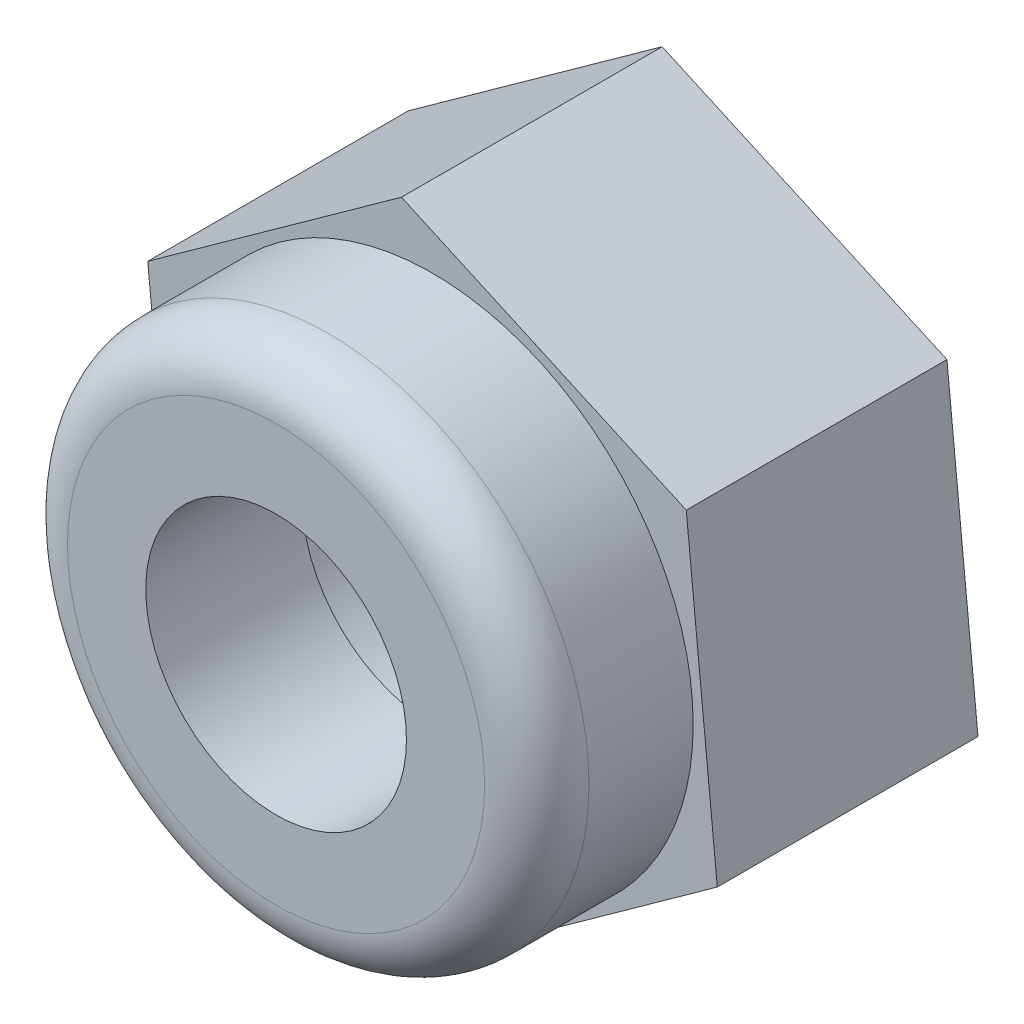
ISO-10303-21;
HEADER;
FILE_DESCRIPTION(('STEP AP214'),'2;1');
FILE_NAME('part.step','',(''),(''),'','','');
FILE_SCHEMA(('AUTOMOTIVE_DESIGN { 1 0 10303 214 1 1 1 1 }'));
ENDSEC;
DATA;
#1=APPLICATION_CONTEXT('core data for automotive mechanical design processes');
#2=APPLICATION_PROTOCOL_DEFINITION('international standard','automotive_design',2000,#1);
#3=PRODUCT_CONTEXT('',#1,'mechanical');
#4=PRODUCT('Part','Part','',(#3));
#5=PRODUCT_RELATED_PRODUCT_CATEGORY('part','',(#4));
#6=PRODUCT_DEFINITION_FORMATION('','',#4);
#7=PRODUCT_DEFINITION_CONTEXT('part definition',#1,'design');
#8=PRODUCT_DEFINITION('design','',#6,#7);
#9=PRODUCT_DEFINITION_SHAPE('','',#8);
#10=(LENGTH_UNIT() NAMED_UNIT(*) SI_UNIT(.MILLI.,.METRE.));
#11=(NAMED_UNIT(*) PLANE_ANGLE_UNIT() SI_UNIT($,.RADIAN.));
#12=(NAMED_UNIT(*) SI_UNIT($,.STERADIAN.) SOLID_ANGLE_UNIT());
#13=UNCERTAINTY_MEASURE_WITH_UNIT(LENGTH_MEASURE(1.E-05),#10,'distance_accuracy_value','');
#14=(GEOMETRIC_REPRESENTATION_CONTEXT(3) GLOBAL_UNCERTAINTY_ASSIGNED_CONTEXT((#13)) GLOBAL_UNIT_ASSIGNED_CONTEXT((#10,
#11,#12)) REPRESENTATION_CONTEXT('',''));
#15=CARTESIAN_POINT('',(0.,0.,0.));
#16=DIRECTION('',(0.,0.,1.));
#17=DIRECTION('',(1.,0.,0.));
#18=AXIS2_PLACEMENT_3D('',#15,#16,#17);
#19=CARTESIAN_POINT('',(0.,0.,0.));
#20=DIRECTION('',(0.,0.,1.));
#21=DIRECTION('',(1.,0.,0.));
#22=AXIS2_PLACEMENT_3D('',#19,#20,#21);
#23=PLANE('',#22);
#24=CARTESIAN_POINT('',(0.,0.,0.));
#25=DIRECTION('',(0.,0.,1.));
#26=DIRECTION('',(1.,0.,0.));
#27=AXIS2_PLACEMENT_3D('',#24,#25,#26);
#28=CIRCLE('',#27,1.25);
#29=CARTESIAN_POINT('',(1.25,0.,0.));
#30=VERTEX_POINT('',#29);
#31=EDGE_CURVE('E149',#30,#30,#28,.T.);
#32=ORIENTED_EDGE('',*,*,#31,.T.);
#33=EDGE_LOOP('',(#32));
#34=FACE_BOUND('',#33,.T.);
#35=CARTESIAN_POINT('',(0.,0.,0.));
#36=DIRECTION('',(0.,0.,-1.));
#37=DIRECTION('',(-1.,0.,0.));
#38=AXIS2_PLACEMENT_3D('',#35,#36,#37);
#39=CIRCLE('',#38,1.5);
#40=CARTESIAN_POINT('',(-1.5,0.,0.));
#41=VERTEX_POINT('',#40);
#42=EDGE_CURVE('E299',#41,#41,#39,.T.);
#43=ORIENTED_EDGE('',*,*,#42,.T.);
#44=EDGE_LOOP('',(#43));
#45=FACE_BOUND('',#44,.T.);
#46=ADVANCED_FACE('F38',(#34,#45),#23,.F.);
#47=CARTESIAN_POINT('',(0.,0.,1.5));
#48=DIRECTION('',(0.,0.,1.));
#49=DIRECTION('',(1.,0.,0.));
#50=AXIS2_PLACEMENT_3D('',#47,#48,#49);
#51=PLANE('',#50);
#52=CARTESIAN_POINT('',(0.,0.,1.5));
#53=DIRECTION('',(0.,0.,1.));
#54=DIRECTION('',(1.,0.,0.));
#55=AXIS2_PLACEMENT_3D('',#52,#53,#54);
#56=CIRCLE('',#55,2.);
#57=CARTESIAN_POINT('',(2.,0.,1.5));
#58=VERTEX_POINT('',#57);
#59=EDGE_CURVE('E47',#58,#58,#56,.T.);
#60=ORIENTED_EDGE('',*,*,#59,.T.);
#61=EDGE_LOOP('',(#60));
#62=FACE_BOUND('',#61,.T.);
#63=CARTESIAN_POINT('',(0.,0.,1.5));
#64=DIRECTION('',(0.,0.,1.));
#65=DIRECTION('',(1.,0.,0.));
#66=AXIS2_PLACEMENT_3D('',#63,#64,#65);
#67=CIRCLE('',#66,1.25);
#68=CARTESIAN_POINT('',(1.25,0.,1.5));
#69=VERTEX_POINT('',#68);
#70=EDGE_CURVE('E146',#69,#69,#67,.T.);
#71=ORIENTED_EDGE('',*,*,#70,.F.);
#72=EDGE_LOOP('',(#71));
#73=FACE_BOUND('',#72,.T.);
#74=ADVANCED_FACE('F156',(#62,#73),#51,.T.);
#75=CARTESIAN_POINT('',(0.,0.,1.5));
#76=DIRECTION('',(0.,0.,-1.));
#77=DIRECTION('',(-1.,0.,0.));
#78=AXIS2_PLACEMENT_3D('',#75,#76,#77);
#79=CYLINDRICAL_SURFACE('',#78,2.5);
#80=CARTESIAN_POINT('',(0.,0.,1.));
#81=DIRECTION('',(0.,0.,1.));
#82=DIRECTION('',(1.,0.,0.));
#83=AXIS2_PLACEMENT_3D('',#80,#81,#82);
#84=CIRCLE('',#83,2.5);
#85=CARTESIAN_POINT('',(2.5,0.,1.));
#86=VERTEX_POINT('',#85);
#87=EDGE_CURVE('E11',#86,#86,#84,.F.);
#88=ORIENTED_EDGE('',*,*,#87,.T.);
#89=EDGE_LOOP('',(#88));
#90=FACE_BOUND('',#89,.T.);
#91=CARTESIAN_POINT('',(0.,0.,0.));
#92=DIRECTION('',(0.,0.,1.));
#93=DIRECTION('',(1.,0.,0.));
#94=AXIS2_PLACEMENT_3D('',#91,#92,#93);
#95=CIRCLE('',#94,2.5);
#96=CARTESIAN_POINT('',(2.5,0.,0.));
#97=VERTEX_POINT('',#96);
#98=EDGE_CURVE('E145',#97,#97,#95,.T.);
#99=ORIENTED_EDGE('',*,*,#98,.T.);
#100=EDGE_LOOP('',(#99));
#101=FACE_BOUND('',#100,.T.);
#102=ADVANCED_FACE('F168',(#90,#101),#79,.T.);
#103=CARTESIAN_POINT('',(0.,0.,1.5));
#104=DIRECTION('',(0.,0.,-1.));
#105=DIRECTION('',(-1.,0.,0.));
#106=AXIS2_PLACEMENT_3D('',#103,#104,#105);
#107=CYLINDRICAL_SURFACE('',#106,1.25);
#108=ORIENTED_EDGE('',*,*,#70,.T.);
#109=EDGE_LOOP('',(#108));
#110=FACE_BOUND('',#109,.T.);
#111=ORIENTED_EDGE('',*,*,#31,.F.);
#112=EDGE_LOOP('',(#111));
#113=FACE_BOUND('',#112,.T.);
#114=ADVANCED_FACE('F160',(#110,#113),#107,.F.);
#115=CARTESIAN_POINT('',(0.,0.,1.));
#116=DIRECTION('',(0.,0.,1.));
#117=DIRECTION('',(1.,0.,0.));
#118=AXIS2_PLACEMENT_3D('',#115,#116,#117);
#119=TOROIDAL_SURFACE('',#118,2.,0.5);
#120=ORIENTED_EDGE('',*,*,#87,.F.);
#121=EDGE_LOOP('',(#120));
#122=FACE_BOUND('',#121,.T.);
#123=ORIENTED_EDGE('',*,*,#59,.F.);
#124=EDGE_LOOP('',(#123));
#125=FACE_BOUND('',#124,.T.);
#126=ADVANCED_FACE('F40',(#122,#125),#119,.T.);
#127=CARTESIAN_POINT('',(0.,0.,-2.5));
#128=DIRECTION('',(0.,0.,-1.));
#129=DIRECTION('',(-1.,0.,0.));
#130=AXIS2_PLACEMENT_3D('',#127,#128,#129);
#131=PLANE('',#130);
#132=DIRECTION('',(-0.911421395748694,0.411474226861784,0.));
#133=VECTOR('',#132,1.);
#134=CARTESIAN_POINT('',(0.297737743622565,-2.98161906286208,-2.5));
#135=LINE('',#134,#133);
#136=CARTESIAN_POINT('',(0.297737743622565,-2.98161906286208,-2.5));
#137=VERTEX_POINT('',#136);
#138=CARTESIAN_POINT('',(-2.43328898103523,-1.74865798107364,-2.5));
#139=VERTEX_POINT('',#138);
#140=EDGE_CURVE('E136',#137,#139,#135,.T.);
#141=ORIENTED_EDGE('',*,*,#140,.T.);
#142=DIRECTION('',(-0.0993635644094802,0.995051195701931,0.));
#143=VECTOR('',#142,1.);
#144=CARTESIAN_POINT('',(-2.43328898103523,-1.74865798107364,-2.5));
#145=LINE('',#144,#143);
#146=CARTESIAN_POINT('',(-2.73102672465779,1.23296108178844,-2.5));
#147=VERTEX_POINT('',#146);
#148=EDGE_CURVE('E93',#139,#147,#145,.T.);
#149=ORIENTED_EDGE('',*,*,#148,.T.);
#150=DIRECTION('',(0.812057831339213,0.583576968840147,0.));
#151=VECTOR('',#150,1.);
#152=CARTESIAN_POINT('',(-2.73102672465779,1.23296108178844,-2.5));
#153=LINE('',#152,#151);
#154=CARTESIAN_POINT('',(-0.297737743622566,2.98161906286208,-2.5));
#155=VERTEX_POINT('',#154);
#156=EDGE_CURVE('E107',#147,#155,#153,.T.);
#157=ORIENTED_EDGE('',*,*,#156,.T.);
#158=DIRECTION('',(0.911421395748694,-0.411474226861784,0.));
#159=VECTOR('',#158,1.);
#160=CARTESIAN_POINT('',(-0.297737743622566,2.98161906286208,-2.5));
#161=LINE('',#160,#159);
#162=CARTESIAN_POINT('',(2.43328898103522,1.74865798107364,-2.5));
#163=VERTEX_POINT('',#162);
#164=EDGE_CURVE('E100',#155,#163,#161,.T.);
#165=ORIENTED_EDGE('',*,*,#164,.T.);
#166=DIRECTION('',(0.0993635644094805,-0.995051195701931,0.));
#167=VECTOR('',#166,1.);
#168=CARTESIAN_POINT('',(2.43328898103522,1.74865798107364,-2.5));
#169=LINE('',#168,#167);
#170=CARTESIAN_POINT('',(2.73102672465779,-1.23296108178844,-2.5));
#171=VERTEX_POINT('',#170);
#172=EDGE_CURVE('E105',#163,#171,#169,.T.);
#173=ORIENTED_EDGE('',*,*,#172,.T.);
#174=DIRECTION('',(-0.812057831339213,-0.583576968840147,0.));
#175=VECTOR('',#174,1.);
#176=CARTESIAN_POINT('',(2.73102672465779,-1.23296108178844,-2.5));
#177=LINE('',#176,#175);
#178=EDGE_CURVE('E55',#171,#137,#177,.T.);
#179=ORIENTED_EDGE('',*,*,#178,.T.);
#180=EDGE_LOOP('',(#141,#149,#157,#165,#173,#179));
#181=FACE_BOUND('',#180,.T.);
#182=CARTESIAN_POINT('',(0.,0.,-2.5));
#183=DIRECTION('',(0.,0.,-1.));
#184=DIRECTION('',(-1.,0.,0.));
#185=AXIS2_PLACEMENT_3D('',#182,#183,#184);
#186=CIRCLE('',#185,1.5);
#187=CARTESIAN_POINT('',(-1.5,0.,-2.5));
#188=VERTEX_POINT('',#187);
#189=EDGE_CURVE('E129',#188,#188,#186,.T.);
#190=ORIENTED_EDGE('',*,*,#189,.F.);
#191=EDGE_LOOP('',(#190));
#192=FACE_BOUND('',#191,.T.);
#193=ADVANCED_FACE('F102',(#181,#192),#131,.T.);
#194=CARTESIAN_POINT('',(0.,0.,0.));
#195=DIRECTION('',(0.,0.,-1.));
#196=DIRECTION('',(-1.,0.,0.));
#197=AXIS2_PLACEMENT_3D('',#194,#195,#196);
#198=PLANE('',#197);
#199=ORIENTED_EDGE('',*,*,#98,.F.);
#200=EDGE_LOOP('',(#199));
#201=FACE_BOUND('',#200,.T.);
#202=DIRECTION('',(-0.911421395748694,0.411474226861784,0.));
#203=VECTOR('',#202,1.);
#204=CARTESIAN_POINT('',(0.297737743622565,-2.98161906286208,0.));
#205=LINE('',#204,#203);
#206=CARTESIAN_POINT('',(0.297737743622565,-2.98161906286208,0.));
#207=VERTEX_POINT('',#206);
#208=CARTESIAN_POINT('',(-2.43328898103523,-1.74865798107364,0.));
#209=VERTEX_POINT('',#208);
#210=EDGE_CURVE('E125',#207,#209,#205,.T.);
#211=ORIENTED_EDGE('',*,*,#210,.F.);
#212=DIRECTION('',(-0.812057831339213,-0.583576968840147,0.));
#213=VECTOR('',#212,1.);
#214=CARTESIAN_POINT('',(2.73102672465779,-1.23296108178844,0.));
#215=LINE('',#214,#213);
#216=CARTESIAN_POINT('',(2.73102672465779,-1.23296108178844,0.));
#217=VERTEX_POINT('',#216);
#218=EDGE_CURVE('E84',#217,#207,#215,.T.);
#219=ORIENTED_EDGE('',*,*,#218,.F.);
#220=DIRECTION('',(0.0993635644094805,-0.995051195701931,0.));
#221=VECTOR('',#220,1.);
#222=CARTESIAN_POINT('',(2.43328898103522,1.74865798107364,0.));
#223=LINE('',#222,#221);
#224=CARTESIAN_POINT('',(2.43328898103522,1.74865798107364,0.));
#225=VERTEX_POINT('',#224);
#226=EDGE_CURVE('E78',#225,#217,#223,.T.);
#227=ORIENTED_EDGE('',*,*,#226,.F.);
#228=DIRECTION('',(0.911421395748694,-0.411474226861784,0.));
#229=VECTOR('',#228,1.);
#230=CARTESIAN_POINT('',(-0.297737743622566,2.98161906286208,0.));
#231=LINE('',#230,#229);
#232=CARTESIAN_POINT('',(-0.297737743622566,2.98161906286208,0.));
#233=VERTEX_POINT('',#232);
#234=EDGE_CURVE('E115',#233,#225,#231,.T.);
#235=ORIENTED_EDGE('',*,*,#234,.F.);
#236=DIRECTION('',(0.812057831339213,0.583576968840147,0.));
#237=VECTOR('',#236,1.);
#238=CARTESIAN_POINT('',(-2.73102672465779,1.23296108178844,0.));
#239=LINE('',#238,#237);
#240=CARTESIAN_POINT('',(-2.73102672465779,1.23296108178844,0.));
#241=VERTEX_POINT('',#240);
#242=EDGE_CURVE('E131',#241,#233,#239,.T.);
#243=ORIENTED_EDGE('',*,*,#242,.F.);
#244=DIRECTION('',(-0.0993635644094802,0.995051195701931,0.));
#245=VECTOR('',#244,1.);
#246=CARTESIAN_POINT('',(-2.43328898103523,-1.74865798107364,0.));
#247=LINE('',#246,#245);
#248=EDGE_CURVE('E128',#209,#241,#247,.T.);
#249=ORIENTED_EDGE('',*,*,#248,.F.);
#250=EDGE_LOOP('',(#211,#219,#227,#235,#243,#249));
#251=FACE_BOUND('',#250,.T.);
#252=ADVANCED_FACE('F166',(#201,#251),#198,.F.);
#253=CARTESIAN_POINT('',(0.297737743622565,-2.98161906286208,-2.5));
#254=DIRECTION('',(0.411474226861785,0.911421395748694,0.));
#255=DIRECTION('',(-0.911421395748694,0.411474226861785,0.));
#256=AXIS2_PLACEMENT_3D('',#253,#254,#255);
#257=PLANE('',#256);
#258=ORIENTED_EDGE('',*,*,#210,.T.);
#259=DIRECTION('',(0.,0.,1.));
#260=VECTOR('',#259,1.);
#261=CARTESIAN_POINT('',(-2.43328898103523,-1.74865798107364,-2.5));
#262=LINE('',#261,#260);
#263=EDGE_CURVE('E143',#139,#209,#262,.T.);
#264=ORIENTED_EDGE('',*,*,#263,.F.);
#265=ORIENTED_EDGE('',*,*,#140,.F.);
#266=DIRECTION('',(0.,0.,1.));
#267=VECTOR('',#266,1.);
#268=CARTESIAN_POINT('',(0.297737743622565,-2.98161906286208,-2.5));
#269=LINE('',#268,#267);
#270=EDGE_CURVE('E121',#137,#207,#269,.T.);
#271=ORIENTED_EDGE('',*,*,#270,.T.);
#272=EDGE_LOOP('',(#258,#264,#265,#271));
#273=FACE_BOUND('',#272,.T.);
#274=ADVANCED_FACE('F189',(#273),#257,.F.);
#275=CARTESIAN_POINT('',(-2.43328898103523,-1.74865798107364,-2.5));
#276=DIRECTION('',(0.995051195701931,0.0993635644094802,0.));
#277=DIRECTION('',(-0.0993635644094802,0.995051195701931,0.));
#278=AXIS2_PLACEMENT_3D('',#275,#276,#277);
#279=PLANE('',#278);
#280=ORIENTED_EDGE('',*,*,#248,.T.);
#281=DIRECTION('',(0.,0.,1.));
#282=VECTOR('',#281,1.);
#283=CARTESIAN_POINT('',(-2.73102672465779,1.23296108178844,-2.5));
#284=LINE('',#283,#282);
#285=EDGE_CURVE('E140',#147,#241,#284,.T.);
#286=ORIENTED_EDGE('',*,*,#285,.F.);
#287=ORIENTED_EDGE('',*,*,#148,.F.);
#288=ORIENTED_EDGE('',*,*,#263,.T.);
#289=EDGE_LOOP('',(#280,#286,#287,#288));
#290=FACE_BOUND('',#289,.T.);
#291=ADVANCED_FACE('F213',(#290),#279,.F.);
#292=CARTESIAN_POINT('',(-2.73102672465779,1.23296108178844,-2.5));
#293=DIRECTION('',(0.583576968840147,-0.812057831339213,0.));
#294=DIRECTION('',(0.812057831339213,0.583576968840147,0.));
#295=AXIS2_PLACEMENT_3D('',#292,#293,#294);
#296=PLANE('',#295);
#297=ORIENTED_EDGE('',*,*,#242,.T.);
#298=DIRECTION('',(0.,0.,1.));
#299=VECTOR('',#298,1.);
#300=CARTESIAN_POINT('',(-0.297737743622566,2.98161906286208,-2.5));
#301=LINE('',#300,#299);
#302=EDGE_CURVE('E116',#155,#233,#301,.T.);
#303=ORIENTED_EDGE('',*,*,#302,.F.);
#304=ORIENTED_EDGE('',*,*,#156,.F.);
#305=ORIENTED_EDGE('',*,*,#285,.T.);
#306=EDGE_LOOP('',(#297,#303,#304,#305));
#307=FACE_BOUND('',#306,.T.);
#308=ADVANCED_FACE('F210',(#307),#296,.F.);
#309=CARTESIAN_POINT('',(-0.297737743622566,2.98161906286208,-2.5));
#310=DIRECTION('',(-0.411474226861784,-0.911421395748694,0.));
#311=DIRECTION('',(0.911421395748694,-0.411474226861784,0.));
#312=AXIS2_PLACEMENT_3D('',#309,#310,#311);
#313=PLANE('',#312);
#314=ORIENTED_EDGE('',*,*,#234,.T.);
#315=DIRECTION('',(0.,0.,1.));
#316=VECTOR('',#315,1.);
#317=CARTESIAN_POINT('',(2.43328898103522,1.74865798107364,-2.5));
#318=LINE('',#317,#316);
#319=EDGE_CURVE('E112',#163,#225,#318,.T.);
#320=ORIENTED_EDGE('',*,*,#319,.F.);
#321=ORIENTED_EDGE('',*,*,#164,.F.);
#322=ORIENTED_EDGE('',*,*,#302,.T.);
#323=EDGE_LOOP('',(#314,#320,#321,#322));
#324=FACE_BOUND('',#323,.T.);
#325=ADVANCED_FACE('F113',(#324),#313,.F.);
#326=CARTESIAN_POINT('',(2.43328898103522,1.74865798107364,-2.5));
#327=DIRECTION('',(-0.995051195701931,-0.0993635644094805,0.));
#328=DIRECTION('',(0.0993635644094805,-0.995051195701931,0.));
#329=AXIS2_PLACEMENT_3D('',#326,#327,#328);
#330=PLANE('',#329);
#331=ORIENTED_EDGE('',*,*,#226,.T.);
#332=DIRECTION('',(0.,0.,1.));
#333=VECTOR('',#332,1.);
#334=CARTESIAN_POINT('',(2.73102672465779,-1.23296108178844,-2.5));
#335=LINE('',#334,#333);
#336=EDGE_CURVE('E117',#171,#217,#335,.T.);
#337=ORIENTED_EDGE('',*,*,#336,.F.);
#338=ORIENTED_EDGE('',*,*,#172,.F.);
#339=ORIENTED_EDGE('',*,*,#319,.T.);
#340=EDGE_LOOP('',(#331,#337,#338,#339));
#341=FACE_BOUND('',#340,.T.);
#342=ADVANCED_FACE('F119',(#341),#330,.F.);
#343=CARTESIAN_POINT('',(2.73102672465779,-1.23296108178844,-2.5));
#344=DIRECTION('',(-0.583576968840147,0.812057831339213,0.));
#345=DIRECTION('',(-0.812057831339213,-0.583576968840147,0.));
#346=AXIS2_PLACEMENT_3D('',#343,#344,#345);
#347=PLANE('',#346);
#348=ORIENTED_EDGE('',*,*,#218,.T.);
#349=ORIENTED_EDGE('',*,*,#270,.F.);
#350=ORIENTED_EDGE('',*,*,#178,.F.);
#351=ORIENTED_EDGE('',*,*,#336,.T.);
#352=EDGE_LOOP('',(#348,#349,#350,#351));
#353=FACE_BOUND('',#352,.T.);
#354=ADVANCED_FACE('F196',(#353),#347,.F.);
#355=CARTESIAN_POINT('',(0.,0.,-2.5));
#356=DIRECTION('',(0.,0.,1.));
#357=DIRECTION('',(1.,0.,0.));
#358=AXIS2_PLACEMENT_3D('',#355,#356,#357);
#359=CYLINDRICAL_SURFACE('',#358,1.5);
#360=ORIENTED_EDGE('',*,*,#189,.T.);
#361=EDGE_LOOP('',(#360));
#362=FACE_BOUND('',#361,.T.);
#363=ORIENTED_EDGE('',*,*,#42,.F.);
#364=EDGE_LOOP('',(#363));
#365=FACE_BOUND('',#364,.T.);
#366=ADVANCED_FACE('F198',(#362,#365),#359,.F.);
#367=CLOSED_SHELL('',(#46,#74,#102,#114,#126,#193,#252,#274,#291,#308,#325,#342,#354,#366));
#368=MANIFOLD_SOLID_BREP('B2',#367);
#369=ADVANCED_BREP_SHAPE_REPRESENTATION('',(#18,#368),#14);
#370=SHAPE_DEFINITION_REPRESENTATION(#9,#369);
ENDSEC;
END-ISO-10303-21;
